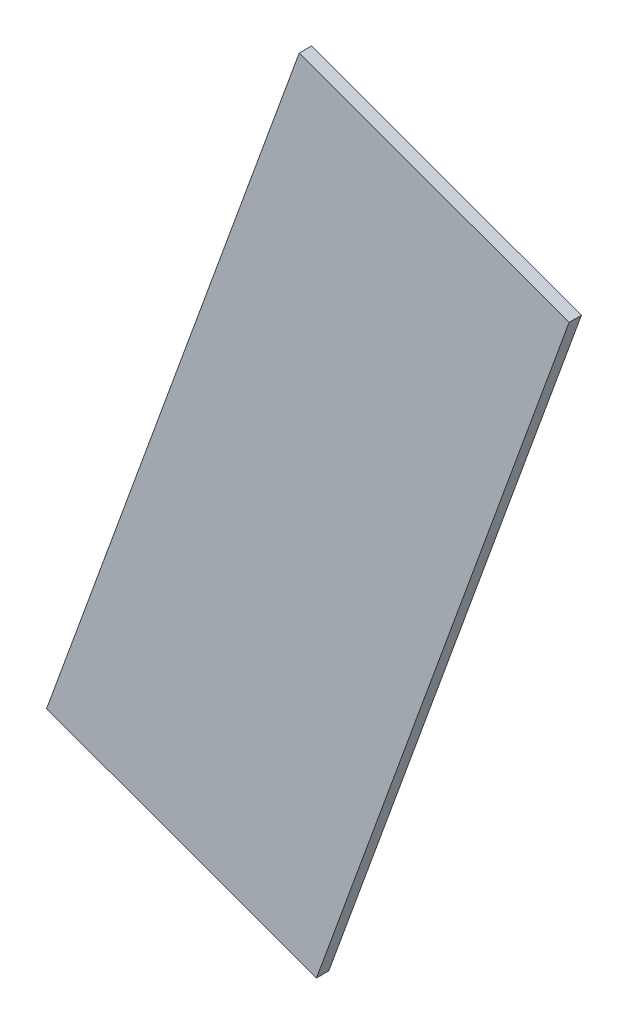
ISO-10303-21;
HEADER;
FILE_DESCRIPTION(('STEP AP214'),'2;1');
FILE_NAME('part.step','',(''),(''),'','','');
FILE_SCHEMA(('AUTOMOTIVE_DESIGN { 1 0 10303 214 1 1 1 1 }'));
ENDSEC;
DATA;
#1=APPLICATION_CONTEXT('core data for automotive mechanical design processes');
#2=APPLICATION_PROTOCOL_DEFINITION('international standard','automotive_design',2000,#1);
#3=PRODUCT_CONTEXT('',#1,'mechanical');
#4=PRODUCT('Part','Part','',(#3));
#5=PRODUCT_RELATED_PRODUCT_CATEGORY('part','',(#4));
#6=PRODUCT_DEFINITION_FORMATION('','',#4);
#7=PRODUCT_DEFINITION_CONTEXT('part definition',#1,'design');
#8=PRODUCT_DEFINITION('design','',#6,#7);
#9=PRODUCT_DEFINITION_SHAPE('','',#8);
#10=(LENGTH_UNIT() NAMED_UNIT(*) SI_UNIT(.MILLI.,.METRE.));
#11=(NAMED_UNIT(*) PLANE_ANGLE_UNIT() SI_UNIT($,.RADIAN.));
#12=(NAMED_UNIT(*) SI_UNIT($,.STERADIAN.) SOLID_ANGLE_UNIT());
#13=UNCERTAINTY_MEASURE_WITH_UNIT(LENGTH_MEASURE(1.E-05),#10,'distance_accuracy_value','');
#14=(GEOMETRIC_REPRESENTATION_CONTEXT(3) GLOBAL_UNCERTAINTY_ASSIGNED_CONTEXT((#13)) GLOBAL_UNIT_ASSIGNED_CONTEXT((#10,
#11,#12)) REPRESENTATION_CONTEXT('',''));
#15=CARTESIAN_POINT('',(0.,0.,0.));
#16=DIRECTION('',(0.,0.,1.));
#17=DIRECTION('',(1.,0.,0.));
#18=AXIS2_PLACEMENT_3D('',#15,#16,#17);
#19=CARTESIAN_POINT('',(385.602183987051,660.225187331798,3.));
#20=DIRECTION('',(0.342020143325666,0.93969262078591,0.));
#21=DIRECTION('',(-0.93969262078591,0.342020143325666,0.));
#22=AXIS2_PLACEMENT_3D('',#19,#20,#21);
#23=PLANE('',#22);
#24=DIRECTION('',(0.939692620785909,-0.342020143325665,0.));
#25=VECTOR('',#24,1.);
#26=CARTESIAN_POINT('',(385.602183987051,660.225187331798,0.));
#27=LINE('',#26,#25);
#28=CARTESIAN_POINT('',(319.823700532038,684.166597364594,0.));
#29=VERTEX_POINT('',#28);
#30=CARTESIAN_POINT('',(385.602183987051,660.225187331798,0.));
#31=VERTEX_POINT('',#30);
#32=EDGE_CURVE('E104',#29,#31,#27,.T.);
#33=ORIENTED_EDGE('',*,*,#32,.T.);
#34=DIRECTION('',(0.,0.,-1.));
#35=VECTOR('',#34,1.);
#36=CARTESIAN_POINT('',(385.602183987051,660.225187331798,3.));
#37=LINE('',#36,#35);
#38=CARTESIAN_POINT('',(385.602183987051,660.225187331798,3.));
#39=VERTEX_POINT('',#38);
#40=EDGE_CURVE('E11',#39,#31,#37,.T.);
#41=ORIENTED_EDGE('',*,*,#40,.F.);
#42=DIRECTION('',(0.939692620785909,-0.342020143325665,0.));
#43=VECTOR('',#42,1.);
#44=CARTESIAN_POINT('',(385.602183987051,660.225187331798,3.));
#45=LINE('',#44,#43);
#46=CARTESIAN_POINT('',(319.823700532038,684.166597364594,3.));
#47=VERTEX_POINT('',#46);
#48=EDGE_CURVE('E92',#47,#39,#45,.T.);
#49=ORIENTED_EDGE('',*,*,#48,.F.);
#50=DIRECTION('',(0.,0.,-1.));
#51=VECTOR('',#50,1.);
#52=CARTESIAN_POINT('',(319.823700532038,684.166597364594,3.));
#53=LINE('',#52,#51);
#54=EDGE_CURVE('E100',#47,#29,#53,.T.);
#55=ORIENTED_EDGE('',*,*,#54,.T.);
#56=EDGE_LOOP('',(#33,#41,#49,#55));
#57=FACE_BOUND('',#56,.T.);
#58=ADVANCED_FACE('F41',(#57),#23,.F.);
#59=CARTESIAN_POINT('',(385.602183987051,660.225187331798,3.));
#60=DIRECTION('',(-0.93969262078591,0.342020143325665,0.));
#61=DIRECTION('',(-0.342020143325665,-0.93969262078591,0.));
#62=AXIS2_PLACEMENT_3D('',#59,#60,#61);
#63=PLANE('',#62);
#64=DIRECTION('',(0.342020143325665,0.93969262078591,0.));
#65=VECTOR('',#64,1.);
#66=CARTESIAN_POINT('',(385.602183987051,660.225187331798,0.));
#67=LINE('',#66,#65);
#68=CARTESIAN_POINT('',(447.165809785671,829.369859073262,0.));
#69=VERTEX_POINT('',#68);
#70=EDGE_CURVE('E96',#31,#69,#67,.T.);
#71=ORIENTED_EDGE('',*,*,#70,.T.);
#72=DIRECTION('',(0.,0.,-1.));
#73=VECTOR('',#72,1.);
#74=CARTESIAN_POINT('',(447.165809785671,829.369859073262,3.));
#75=LINE('',#74,#73);
#76=CARTESIAN_POINT('',(447.165809785671,829.369859073262,3.));
#77=VERTEX_POINT('',#76);
#78=EDGE_CURVE('E49',#77,#69,#75,.T.);
#79=ORIENTED_EDGE('',*,*,#78,.F.);
#80=DIRECTION('',(0.342020143325665,0.93969262078591,0.));
#81=VECTOR('',#80,1.);
#82=CARTESIAN_POINT('',(385.602183987051,660.225187331798,3.));
#83=LINE('',#82,#81);
#84=EDGE_CURVE('E87',#39,#77,#83,.T.);
#85=ORIENTED_EDGE('',*,*,#84,.F.);
#86=ORIENTED_EDGE('',*,*,#40,.T.);
#87=EDGE_LOOP('',(#71,#79,#85,#86));
#88=FACE_BOUND('',#87,.T.);
#89=ADVANCED_FACE('F95',(#88),#63,.F.);
#90=CARTESIAN_POINT('',(447.165809785671,829.369859073262,3.));
#91=DIRECTION('',(-0.342020143325666,-0.93969262078591,0.));
#92=DIRECTION('',(0.93969262078591,-0.342020143325666,0.));
#93=AXIS2_PLACEMENT_3D('',#90,#91,#92);
#94=PLANE('',#93);
#95=DIRECTION('',(-0.939692620785909,0.342020143325666,0.));
#96=VECTOR('',#95,1.);
#97=CARTESIAN_POINT('',(447.165809785671,829.369859073262,0.));
#98=LINE('',#97,#96);
#99=CARTESIAN_POINT('',(381.387326330657,853.311269106058,0.));
#100=VERTEX_POINT('',#99);
#101=EDGE_CURVE('E74',#69,#100,#98,.T.);
#102=ORIENTED_EDGE('',*,*,#101,.T.);
#103=DIRECTION('',(0.,0.,-1.));
#104=VECTOR('',#103,1.);
#105=CARTESIAN_POINT('',(381.387326330657,853.311269106058,3.));
#106=LINE('',#105,#104);
#107=CARTESIAN_POINT('',(381.387326330657,853.311269106058,3.));
#108=VERTEX_POINT('',#107);
#109=EDGE_CURVE('E97',#108,#100,#106,.T.);
#110=ORIENTED_EDGE('',*,*,#109,.F.);
#111=DIRECTION('',(-0.939692620785909,0.342020143325666,0.));
#112=VECTOR('',#111,1.);
#113=CARTESIAN_POINT('',(447.165809785671,829.369859073262,3.));
#114=LINE('',#113,#112);
#115=EDGE_CURVE('E90',#77,#108,#114,.T.);
#116=ORIENTED_EDGE('',*,*,#115,.F.);
#117=ORIENTED_EDGE('',*,*,#78,.T.);
#118=EDGE_LOOP('',(#102,#110,#116,#117));
#119=FACE_BOUND('',#118,.T.);
#120=ADVANCED_FACE('F98',(#119),#94,.F.);
#121=CARTESIAN_POINT('',(319.823700532038,684.166597364594,3.));
#122=DIRECTION('',(0.93969262078591,-0.342020143325665,0.));
#123=DIRECTION('',(0.342020143325665,0.93969262078591,0.));
#124=AXIS2_PLACEMENT_3D('',#121,#122,#123);
#125=PLANE('',#124);
#126=DIRECTION('',(-0.342020143325666,-0.93969262078591,0.));
#127=VECTOR('',#126,1.);
#128=CARTESIAN_POINT('',(319.823700532038,684.166597364594,0.));
#129=LINE('',#128,#127);
#130=EDGE_CURVE('E80',#100,#29,#129,.T.);
#131=ORIENTED_EDGE('',*,*,#130,.T.);
#132=ORIENTED_EDGE('',*,*,#54,.F.);
#133=DIRECTION('',(-0.342020143325666,-0.93969262078591,0.));
#134=VECTOR('',#133,1.);
#135=CARTESIAN_POINT('',(319.823700532038,684.166597364594,3.));
#136=LINE('',#135,#134);
#137=EDGE_CURVE('E57',#108,#47,#136,.T.);
#138=ORIENTED_EDGE('',*,*,#137,.F.);
#139=ORIENTED_EDGE('',*,*,#109,.T.);
#140=EDGE_LOOP('',(#131,#132,#138,#139));
#141=FACE_BOUND('',#140,.T.);
#142=ADVANCED_FACE('F111',(#141),#125,.F.);
#143=CARTESIAN_POINT('',(0.,0.,3.));
#144=DIRECTION('',(0.,0.,-1.));
#145=DIRECTION('',(-1.,0.,0.));
#146=AXIS2_PLACEMENT_3D('',#143,#144,#145);
#147=PLANE('',#146);
#148=ORIENTED_EDGE('',*,*,#48,.T.);
#149=ORIENTED_EDGE('',*,*,#84,.T.);
#150=ORIENTED_EDGE('',*,*,#115,.T.);
#151=ORIENTED_EDGE('',*,*,#137,.T.);
#152=EDGE_LOOP('',(#148,#149,#150,#151));
#153=FACE_BOUND('',#152,.T.);
#154=ADVANCED_FACE('F88',(#153),#147,.F.);
#155=CARTESIAN_POINT('',(0.,0.,0.));
#156=DIRECTION('',(0.,0.,-1.));
#157=DIRECTION('',(-1.,0.,0.));
#158=AXIS2_PLACEMENT_3D('',#155,#156,#157);
#159=PLANE('',#158);
#160=ORIENTED_EDGE('',*,*,#32,.F.);
#161=ORIENTED_EDGE('',*,*,#130,.F.);
#162=ORIENTED_EDGE('',*,*,#101,.F.);
#163=ORIENTED_EDGE('',*,*,#70,.F.);
#164=EDGE_LOOP('',(#160,#161,#162,#163));
#165=FACE_BOUND('',#164,.T.);
#166=ADVANCED_FACE('F114',(#165),#159,.T.);
#167=CLOSED_SHELL('',(#58,#89,#120,#142,#154,#166));
#168=MANIFOLD_SOLID_BREP('B2',#167);
#169=ADVANCED_BREP_SHAPE_REPRESENTATION('',(#18,#168),#14);
#170=SHAPE_DEFINITION_REPRESENTATION(#9,#169);
ENDSEC;
END-ISO-10303-21;
